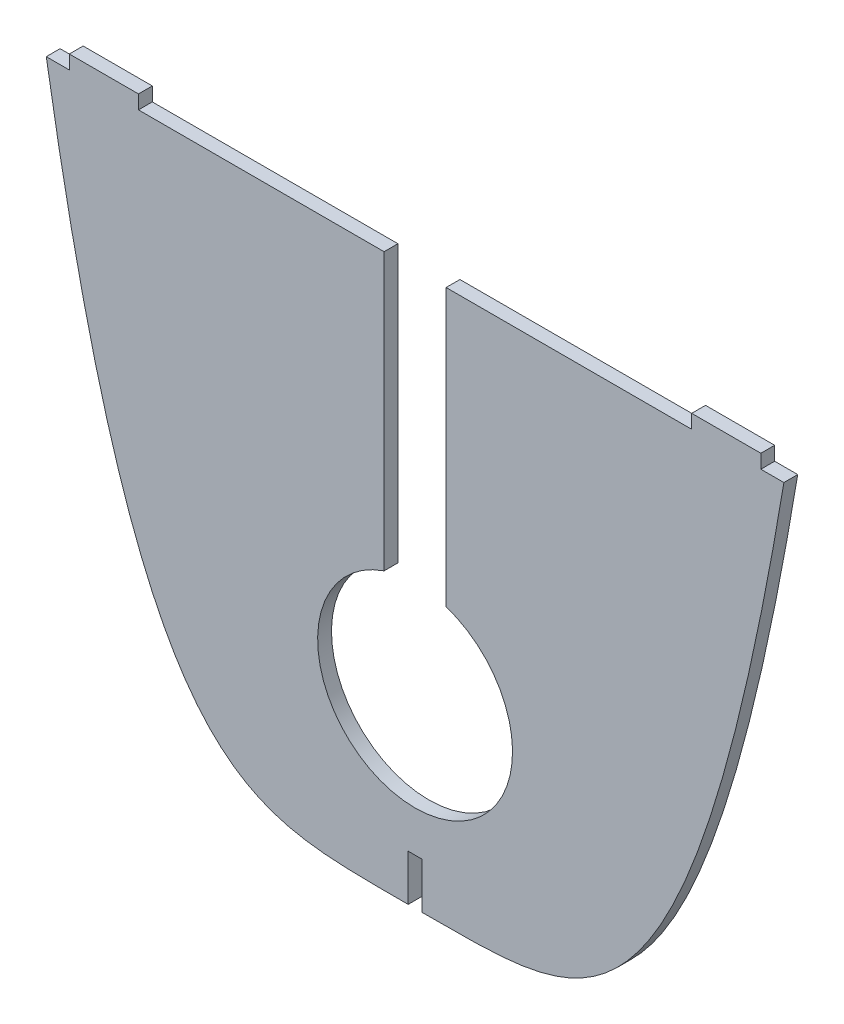
ISO-10303-21;
HEADER;
FILE_DESCRIPTION(('STEP AP214'),'2;1');
FILE_NAME('part.step','',(''),(''),'','','');
FILE_SCHEMA(('AUTOMOTIVE_DESIGN { 1 0 10303 214 1 1 1 1 }'));
ENDSEC;
DATA;
#1=APPLICATION_CONTEXT('core data for automotive mechanical design processes');
#2=APPLICATION_PROTOCOL_DEFINITION('international standard','automotive_design',2000,#1);
#3=PRODUCT_CONTEXT('',#1,'mechanical');
#4=PRODUCT('Part','Part','',(#3));
#5=PRODUCT_RELATED_PRODUCT_CATEGORY('part','',(#4));
#6=PRODUCT_DEFINITION_FORMATION('','',#4);
#7=PRODUCT_DEFINITION_CONTEXT('part definition',#1,'design');
#8=PRODUCT_DEFINITION('design','',#6,#7);
#9=PRODUCT_DEFINITION_SHAPE('','',#8);
#10=(LENGTH_UNIT() NAMED_UNIT(*) SI_UNIT(.MILLI.,.METRE.));
#11=(NAMED_UNIT(*) PLANE_ANGLE_UNIT() SI_UNIT($,.RADIAN.));
#12=(NAMED_UNIT(*) SI_UNIT($,.STERADIAN.) SOLID_ANGLE_UNIT());
#13=UNCERTAINTY_MEASURE_WITH_UNIT(LENGTH_MEASURE(1.E-05),#10,'distance_accuracy_value','');
#14=(GEOMETRIC_REPRESENTATION_CONTEXT(3) GLOBAL_UNCERTAINTY_ASSIGNED_CONTEXT((#13)) GLOBAL_UNIT_ASSIGNED_CONTEXT((#10,
#11,#12)) REPRESENTATION_CONTEXT('',''));
#15=CARTESIAN_POINT('',(0.,0.,0.));
#16=DIRECTION('',(0.,0.,1.));
#17=DIRECTION('',(1.,0.,0.));
#18=AXIS2_PLACEMENT_3D('',#15,#16,#17);
#19=CARTESIAN_POINT('',(-80.0000000053651,119.999999903766,3.));
#20=CARTESIAN_POINT('',(-39.999999975373,-120.000000248008,3.));
#21=CARTESIAN_POINT('',(2.93161022801164E-08,120.000000082844,3.));
#22=CARTESIAN_POINT('',(40.0000000593082,-120.000000418652,3.));
#23=CARTESIAN_POINT('',(80.0000000639973,120.000000261923,3.));
#24=B_SPLINE_CURVE_WITH_KNOTS('',4,(#19,#20,#21,#22,#23),.UNSPECIFIED.,.F.,.F.,(5,5),
(0.0288543219828918,0.971145678360379),.UNSPECIFIED.);
#25=DIRECTION('',(0.,0.,-1.));
#26=VECTOR('',#25,1.);
#27=SURFACE_OF_LINEAR_EXTRUSION('',#24,#26);
#28=CARTESIAN_POINT('',(-80.0000000053651,119.999999903766,0.));
#29=CARTESIAN_POINT('',(-39.999999975373,-120.000000248008,0.));
#30=CARTESIAN_POINT('',(2.93161022801164E-08,120.000000082844,0.));
#31=CARTESIAN_POINT('',(40.0000000593082,-120.000000418652,0.));
#32=CARTESIAN_POINT('',(80.0000000639973,120.000000261923,0.));
#33=B_SPLINE_CURVE_WITH_KNOTS('',4,(#28,#29,#30,#31,#32),.UNSPECIFIED.,.F.,.F.,(5,5),
(0.0288543219828918,0.971145678360379),.UNSPECIFIED.);
#34=CARTESIAN_POINT('',(-80.0000000053651,119.999999903766,0.));
#35=VERTEX_POINT('',#34);
#36=CARTESIAN_POINT('',(-1.49999999999999,1.47062215494968E-05,0.));
#37=VERTEX_POINT('',#36);
#38=EDGE_CURVE('E305',#35,#37,#33,.T.);
#39=ORIENTED_EDGE('',*,*,#38,.T.);
#40=DIRECTION('',(0.,0.,-1.));
#41=VECTOR('',#40,1.);
#42=CARTESIAN_POINT('',(-1.49999999999999,1.47062215494968E-05,3.));
#43=LINE('',#42,#41);
#44=CARTESIAN_POINT('',(-1.5,1.47062215495597E-05,3.));
#45=VERTEX_POINT('',#44);
#46=EDGE_CURVE('E52',#37,#45,#43,.F.);
#47=ORIENTED_EDGE('',*,*,#46,.T.);
#48=CARTESIAN_POINT('',(-80.0000000053651,119.999999903766,3.));
#49=VERTEX_POINT('',#48);
#50=EDGE_CURVE('E256',#49,#45,#24,.T.);
#51=ORIENTED_EDGE('',*,*,#50,.F.);
#52=DIRECTION('',(0.,0.,-1.));
#53=VECTOR('',#52,1.);
#54=CARTESIAN_POINT('',(-80.0000000053651,119.999999903766,3.));
#55=LINE('',#54,#53);
#56=EDGE_CURVE('E307',#49,#35,#55,.T.);
#57=ORIENTED_EDGE('',*,*,#56,.T.);
#58=EDGE_LOOP('',(#39,#47,#51,#57));
#59=FACE_BOUND('',#58,.T.);
#60=ADVANCED_FACE('F43',(#59),#27,.F.);
#61=CARTESIAN_POINT('',(-6.72511862321923,120.000000041199,3.));
#62=DIRECTION('',(1.,0.,0.));
#63=DIRECTION('',(0.,0.,-1.));
#64=AXIS2_PLACEMENT_3D('',#61,#62,#63);
#65=PLANE('',#64);
#66=DIRECTION('',(0.,-1.,0.));
#67=VECTOR('',#66,1.);
#68=CARTESIAN_POINT('',(-6.72511862321923,120.000000041199,3.));
#69=LINE('',#68,#67);
#70=CARTESIAN_POINT('',(-6.72511862321923,120.000000041199,3.));
#71=VERTEX_POINT('',#70);
#72=CARTESIAN_POINT('',(-6.72511862321923,60.037638454475,3.));
#73=VERTEX_POINT('',#72);
#74=EDGE_CURVE('E215',#71,#73,#69,.T.);
#75=ORIENTED_EDGE('',*,*,#74,.T.);
#76=DIRECTION('',(0.,0.,-1.));
#77=VECTOR('',#76,1.);
#78=CARTESIAN_POINT('',(-6.72511862321923,60.037638454475,3.));
#79=LINE('',#78,#77);
#80=CARTESIAN_POINT('',(-6.72511862321923,60.037638454475,0.));
#81=VERTEX_POINT('',#80);
#82=EDGE_CURVE('E204',#73,#81,#79,.T.);
#83=ORIENTED_EDGE('',*,*,#82,.T.);
#84=DIRECTION('',(0.,-1.,0.));
#85=VECTOR('',#84,1.);
#86=CARTESIAN_POINT('',(-6.72511862321923,120.000000041199,0.));
#87=LINE('',#86,#85);
#88=CARTESIAN_POINT('',(-6.72511862321923,120.000000041199,0.));
#89=VERTEX_POINT('',#88);
#90=EDGE_CURVE('E216',#89,#81,#87,.T.);
#91=ORIENTED_EDGE('',*,*,#90,.F.);
#92=DIRECTION('',(0.,0.,-1.));
#93=VECTOR('',#92,1.);
#94=CARTESIAN_POINT('',(-6.72511862321923,120.000000041199,3.));
#95=LINE('',#94,#93);
#96=EDGE_CURVE('E220',#71,#89,#95,.T.);
#97=ORIENTED_EDGE('',*,*,#96,.F.);
#98=EDGE_LOOP('',(#75,#83,#91,#97));
#99=FACE_BOUND('',#98,.T.);
#100=ADVANCED_FACE('F292',(#99),#65,.T.);
#101=CARTESIAN_POINT('',(6.72511862321923,120.000000041199,3.));
#102=DIRECTION('',(-1.,0.,0.));
#103=DIRECTION('',(0.,-1.,0.));
#104=AXIS2_PLACEMENT_3D('',#101,#102,#103);
#105=PLANE('',#104);
#106=DIRECTION('',(0.,1.,0.));
#107=VECTOR('',#106,1.);
#108=CARTESIAN_POINT('',(6.72511862321923,120.000000041199,0.));
#109=LINE('',#108,#107);
#110=CARTESIAN_POINT('',(6.72511862321924,60.0376384544803,0.));
#111=VERTEX_POINT('',#110);
#112=CARTESIAN_POINT('',(6.72511862321923,120.000000041199,0.));
#113=VERTEX_POINT('',#112);
#114=EDGE_CURVE('E211',#111,#113,#109,.T.);
#115=ORIENTED_EDGE('',*,*,#114,.F.);
#116=DIRECTION('',(0.,0.,-1.));
#117=VECTOR('',#116,1.);
#118=CARTESIAN_POINT('',(6.72511862321924,60.0376384544803,3.));
#119=LINE('',#118,#117);
#120=CARTESIAN_POINT('',(6.72511862321923,60.0376384544803,3.));
#121=VERTEX_POINT('',#120);
#122=EDGE_CURVE('E349',#111,#121,#119,.F.);
#123=ORIENTED_EDGE('',*,*,#122,.T.);
#124=DIRECTION('',(0.,1.,0.));
#125=VECTOR('',#124,1.);
#126=CARTESIAN_POINT('',(6.72511862321923,120.000000041199,3.));
#127=LINE('',#126,#125);
#128=CARTESIAN_POINT('',(6.72511862321923,120.000000041199,3.));
#129=VERTEX_POINT('',#128);
#130=EDGE_CURVE('E212',#121,#129,#127,.T.);
#131=ORIENTED_EDGE('',*,*,#130,.T.);
#132=DIRECTION('',(0.,0.,-1.));
#133=VECTOR('',#132,1.);
#134=CARTESIAN_POINT('',(6.72511862321923,120.000000041199,3.));
#135=LINE('',#134,#133);
#136=EDGE_CURVE('E229',#129,#113,#135,.T.);
#137=ORIENTED_EDGE('',*,*,#136,.T.);
#138=EDGE_LOOP('',(#115,#123,#131,#137));
#139=FACE_BOUND('',#138,.T.);
#140=ADVANCED_FACE('F299',(#139),#105,.T.);
#141=CARTESIAN_POINT('',(-55.,120.000000041199,3.));
#142=DIRECTION('',(0.,-1.,0.));
#143=DIRECTION('',(0.,0.,-1.));
#144=AXIS2_PLACEMENT_3D('',#141,#142,#143);
#145=PLANE('',#144);
#146=ORIENTED_EDGE('',*,*,#136,.F.);
#147=DIRECTION('',(1.,0.,0.));
#148=VECTOR('',#147,1.);
#149=CARTESIAN_POINT('',(55.,119.999999994636,3.));
#150=LINE('',#149,#148);
#151=CARTESIAN_POINT('',(60.,119.999999994636,3.));
#152=VERTEX_POINT('',#151);
#153=EDGE_CURVE('E239',#129,#152,#150,.T.);
#154=ORIENTED_EDGE('',*,*,#153,.T.);
#155=DIRECTION('',(0.,0.,-1.));
#156=VECTOR('',#155,1.);
#157=CARTESIAN_POINT('',(60.,119.999999994636,3.));
#158=LINE('',#157,#156);
#159=CARTESIAN_POINT('',(60.,119.999999994636,0.));
#160=VERTEX_POINT('',#159);
#161=EDGE_CURVE('E374',#152,#160,#158,.T.);
#162=ORIENTED_EDGE('',*,*,#161,.T.);
#163=DIRECTION('',(-1.,0.,0.));
#164=VECTOR('',#163,1.);
#165=CARTESIAN_POINT('',(-55.,120.000000041199,0.));
#166=LINE('',#165,#164);
#167=EDGE_CURVE('E341',#160,#113,#166,.T.);
#168=ORIENTED_EDGE('',*,*,#167,.T.);
#169=EDGE_LOOP('',(#146,#154,#162,#168));
#170=FACE_BOUND('',#169,.T.);
#171=ADVANCED_FACE('F419',(#170),#145,.F.);
#172=ORIENTED_EDGE('',*,*,#96,.T.);
#173=CARTESIAN_POINT('',(-60.,120.000000041199,0.));
#174=VERTEX_POINT('',#173);
#175=EDGE_CURVE('E340',#89,#174,#166,.T.);
#176=ORIENTED_EDGE('',*,*,#175,.T.);
#177=DIRECTION('',(0.,0.,-1.));
#178=VECTOR('',#177,1.);
#179=CARTESIAN_POINT('',(-60.,120.000000041199,3.));
#180=LINE('',#179,#178);
#181=CARTESIAN_POINT('',(-60.,120.000000041199,3.));
#182=VERTEX_POINT('',#181);
#183=EDGE_CURVE('E345',#182,#174,#180,.T.);
#184=ORIENTED_EDGE('',*,*,#183,.F.);
#185=EDGE_CURVE('E234',#182,#71,#150,.T.);
#186=ORIENTED_EDGE('',*,*,#185,.T.);
#187=EDGE_LOOP('',(#172,#176,#184,#186));
#188=FACE_BOUND('',#187,.T.);
#189=ADVANCED_FACE('F400',(#188),#145,.F.);
#190=CARTESIAN_POINT('',(-34.8489670671047,78.1029869185064,3.));
#191=DIRECTION('',(0.,0.,-1.));
#192=DIRECTION('',(-1.,0.,0.));
#193=AXIS2_PLACEMENT_3D('',#190,#191,#192);
#194=PLANE('',#193);
#195=ORIENTED_EDGE('',*,*,#50,.T.);
#196=DIRECTION('',(0.,-1.,0.));
#197=VECTOR('',#196,1.);
#198=CARTESIAN_POINT('',(-1.5,10.,3.));
#199=LINE('',#198,#197);
#200=CARTESIAN_POINT('',(-1.5,10.,3.));
#201=VERTEX_POINT('',#200);
#202=EDGE_CURVE('E186',#201,#45,#199,.T.);
#203=ORIENTED_EDGE('',*,*,#202,.F.);
#204=DIRECTION('',(-1.,0.,0.));
#205=VECTOR('',#204,1.);
#206=CARTESIAN_POINT('',(-1.5,10.,3.));
#207=LINE('',#206,#205);
#208=CARTESIAN_POINT('',(1.5,10.,3.));
#209=VERTEX_POINT('',#208);
#210=EDGE_CURVE('E173',#209,#201,#207,.T.);
#211=ORIENTED_EDGE('',*,*,#210,.F.);
#212=DIRECTION('',(0.,1.,0.));
#213=VECTOR('',#212,1.);
#214=CARTESIAN_POINT('',(1.5,10.,3.));
#215=LINE('',#214,#213);
#216=CARTESIAN_POINT('',(1.5,1.47063791804125E-05,3.));
#217=VERTEX_POINT('',#216);
#218=EDGE_CURVE('E180',#217,#209,#215,.T.);
#219=ORIENTED_EDGE('',*,*,#218,.F.);
#220=CARTESIAN_POINT('',(80.0000000639993,120.000000261935,3.));
#221=VERTEX_POINT('',#220);
#222=EDGE_CURVE('E255',#217,#221,#24,.T.);
#223=ORIENTED_EDGE('',*,*,#222,.T.);
#224=DIRECTION('',(1.,0.,0.));
#225=VECTOR('',#224,1.);
#226=CARTESIAN_POINT('',(75.0000000598274,120.000000261935,3.));
#227=LINE('',#226,#225);
#228=CARTESIAN_POINT('',(75.0000000598274,120.000000261935,3.));
#229=VERTEX_POINT('',#228);
#230=EDGE_CURVE('E251',#229,#221,#227,.T.);
#231=ORIENTED_EDGE('',*,*,#230,.F.);
#232=DIRECTION('',(0.,-1.,0.));
#233=VECTOR('',#232,1.);
#234=CARTESIAN_POINT('',(75.0000000598274,123.000000212502,3.));
#235=LINE('',#234,#233);
#236=CARTESIAN_POINT('',(75.0000000598274,123.000000212502,3.));
#237=VERTEX_POINT('',#236);
#238=EDGE_CURVE('E247',#237,#229,#235,.T.);
#239=ORIENTED_EDGE('',*,*,#238,.F.);
#240=DIRECTION('',(1.,0.,0.));
#241=VECTOR('',#240,1.);
#242=CARTESIAN_POINT('',(60.,123.000000212502,3.));
#243=LINE('',#242,#241);
#244=CARTESIAN_POINT('',(60.,123.000000212502,3.));
#245=VERTEX_POINT('',#244);
#246=EDGE_CURVE('E243',#245,#237,#243,.T.);
#247=ORIENTED_EDGE('',*,*,#246,.F.);
#248=DIRECTION('',(0.,1.,0.));
#249=VECTOR('',#248,1.);
#250=CARTESIAN_POINT('',(60.,119.999999994636,3.));
#251=LINE('',#250,#249);
#252=EDGE_CURVE('E238',#152,#245,#251,.T.);
#253=ORIENTED_EDGE('',*,*,#252,.F.);
#254=ORIENTED_EDGE('',*,*,#153,.F.);
#255=ORIENTED_EDGE('',*,*,#130,.F.);
#256=CARTESIAN_POINT('',(7.88091943961699E-12,40.0000000000077,3.));
#257=DIRECTION('',(0.,0.,1.));
#258=DIRECTION('',(1.,0.,0.));
#259=AXIS2_PLACEMENT_3D('',#256,#257,#258);
#260=CIRCLE('',#259,21.1360870391949);
#261=EDGE_CURVE('E67',#73,#121,#260,.T.);
#262=ORIENTED_EDGE('',*,*,#261,.F.);
#263=ORIENTED_EDGE('',*,*,#74,.F.);
#264=ORIENTED_EDGE('',*,*,#185,.F.);
#265=DIRECTION('',(0.,-1.,0.));
#266=VECTOR('',#265,1.);
#267=CARTESIAN_POINT('',(-60.,123.000000023822,3.));
#268=LINE('',#267,#266);
#269=CARTESIAN_POINT('',(-60.,123.000000023822,3.));
#270=VERTEX_POINT('',#269);
#271=EDGE_CURVE('E378',#270,#182,#268,.T.);
#272=ORIENTED_EDGE('',*,*,#271,.F.);
#273=DIRECTION('',(1.,0.,0.));
#274=VECTOR('',#273,1.);
#275=CARTESIAN_POINT('',(-75.0000000011823,123.000000023822,3.));
#276=LINE('',#275,#274);
#277=CARTESIAN_POINT('',(-75.0000000011823,123.000000023822,3.));
#278=VERTEX_POINT('',#277);
#279=EDGE_CURVE('E386',#278,#270,#276,.T.);
#280=ORIENTED_EDGE('',*,*,#279,.F.);
#281=DIRECTION('',(0.,-1.,0.));
#282=VECTOR('',#281,1.);
#283=CARTESIAN_POINT('',(-75.0000000011823,123.000000023822,3.));
#284=LINE('',#283,#282);
#285=CARTESIAN_POINT('',(-75.0000000011823,119.999999901191,3.));
#286=VERTEX_POINT('',#285);
#287=EDGE_CURVE('E390',#278,#286,#284,.T.);
#288=ORIENTED_EDGE('',*,*,#287,.T.);
#289=DIRECTION('',(1.,0.,0.));
#290=VECTOR('',#289,1.);
#291=CARTESIAN_POINT('',(-80.0000000049359,119.999999901191,3.));
#292=LINE('',#291,#290);
#293=EDGE_CURVE('E262',#49,#286,#292,.T.);
#294=ORIENTED_EDGE('',*,*,#293,.F.);
#295=EDGE_LOOP('',(#195,#203,#211,#219,#223,#231,#239,#247,#253,#254,#255,#262,#263,#264,#272,
#280,#288,#294));
#296=FACE_BOUND('',#295,.T.);
#297=ADVANCED_FACE('F189',(#296),#194,.F.);
#298=CARTESIAN_POINT('',(-34.8489670671047,78.1029869185064,0.));
#299=DIRECTION('',(0.,0.,-1.));
#300=DIRECTION('',(-1.,0.,0.));
#301=AXIS2_PLACEMENT_3D('',#298,#299,#300);
#302=PLANE('',#301);
#303=DIRECTION('',(0.,1.,0.));
#304=VECTOR('',#303,1.);
#305=CARTESIAN_POINT('',(-1.50000000000001,78.1029869185064,0.));
#306=LINE('',#305,#304);
#307=CARTESIAN_POINT('',(-1.5,10.,0.));
#308=VERTEX_POINT('',#307);
#309=EDGE_CURVE('E198',#37,#308,#306,.T.);
#310=ORIENTED_EDGE('',*,*,#309,.F.);
#311=ORIENTED_EDGE('',*,*,#38,.F.);
#312=DIRECTION('',(1.,0.,0.));
#313=VECTOR('',#312,1.);
#314=CARTESIAN_POINT('',(-80.0000000049359,119.999999901191,0.));
#315=LINE('',#314,#313);
#316=CARTESIAN_POINT('',(-75.0000000011823,119.999999901191,0.));
#317=VERTEX_POINT('',#316);
#318=EDGE_CURVE('E313',#35,#317,#315,.T.);
#319=ORIENTED_EDGE('',*,*,#318,.T.);
#320=DIRECTION('',(0.,-1.,0.));
#321=VECTOR('',#320,1.);
#322=CARTESIAN_POINT('',(-75.0000000011823,123.000000023822,0.));
#323=LINE('',#322,#321);
#324=CARTESIAN_POINT('',(-75.0000000011823,123.000000023822,0.));
#325=VERTEX_POINT('',#324);
#326=EDGE_CURVE('E318',#325,#317,#323,.T.);
#327=ORIENTED_EDGE('',*,*,#326,.F.);
#328=DIRECTION('',(1.,0.,0.));
#329=VECTOR('',#328,1.);
#330=CARTESIAN_POINT('',(-75.0000000011823,123.000000023822,0.));
#331=LINE('',#330,#329);
#332=CARTESIAN_POINT('',(-60.,123.000000023822,0.));
#333=VERTEX_POINT('',#332);
#334=EDGE_CURVE('E332',#325,#333,#331,.T.);
#335=ORIENTED_EDGE('',*,*,#334,.T.);
#336=DIRECTION('',(0.,-1.,0.));
#337=VECTOR('',#336,1.);
#338=CARTESIAN_POINT('',(-60.,123.000000023822,0.));
#339=LINE('',#338,#337);
#340=EDGE_CURVE('E336',#333,#174,#339,.T.);
#341=ORIENTED_EDGE('',*,*,#340,.T.);
#342=ORIENTED_EDGE('',*,*,#175,.F.);
#343=ORIENTED_EDGE('',*,*,#90,.T.);
#344=CARTESIAN_POINT('',(7.88091943961699E-12,40.0000000000077,0.));
#345=DIRECTION('',(0.,0.,1.));
#346=DIRECTION('',(1.,0.,0.));
#347=AXIS2_PLACEMENT_3D('',#344,#345,#346);
#348=CIRCLE('',#347,21.1360870391949);
#349=EDGE_CURVE('E201',#81,#111,#348,.T.);
#350=ORIENTED_EDGE('',*,*,#349,.T.);
#351=ORIENTED_EDGE('',*,*,#114,.T.);
#352=ORIENTED_EDGE('',*,*,#167,.F.);
#353=DIRECTION('',(0.,1.,0.));
#354=VECTOR('',#353,1.);
#355=CARTESIAN_POINT('',(60.,119.999999994636,0.));
#356=LINE('',#355,#354);
#357=CARTESIAN_POINT('',(60.,123.000000212502,0.));
#358=VERTEX_POINT('',#357);
#359=EDGE_CURVE('E233',#160,#358,#356,.T.);
#360=ORIENTED_EDGE('',*,*,#359,.T.);
#361=DIRECTION('',(1.,0.,0.));
#362=VECTOR('',#361,1.);
#363=CARTESIAN_POINT('',(60.,123.000000212502,0.));
#364=LINE('',#363,#362);
#365=CARTESIAN_POINT('',(75.0000000598274,123.000000212502,0.));
#366=VERTEX_POINT('',#365);
#367=EDGE_CURVE('E425',#358,#366,#364,.T.);
#368=ORIENTED_EDGE('',*,*,#367,.T.);
#369=DIRECTION('',(0.,-1.,0.));
#370=VECTOR('',#369,1.);
#371=CARTESIAN_POINT('',(75.0000000598274,123.000000212502,0.));
#372=LINE('',#371,#370);
#373=CARTESIAN_POINT('',(75.0000000598274,120.000000261935,0.));
#374=VERTEX_POINT('',#373);
#375=EDGE_CURVE('E429',#366,#374,#372,.T.);
#376=ORIENTED_EDGE('',*,*,#375,.T.);
#377=DIRECTION('',(1.,0.,0.));
#378=VECTOR('',#377,1.);
#379=CARTESIAN_POINT('',(75.0000000598274,120.000000261935,0.));
#380=LINE('',#379,#378);
#381=CARTESIAN_POINT('',(80.0000000639993,120.000000261935,0.));
#382=VERTEX_POINT('',#381);
#383=EDGE_CURVE('E320',#374,#382,#380,.T.);
#384=ORIENTED_EDGE('',*,*,#383,.T.);
#385=CARTESIAN_POINT('',(1.50000000000175,1.47063791816823E-05,0.));
#386=VERTEX_POINT('',#385);
#387=EDGE_CURVE('E314',#386,#382,#33,.T.);
#388=ORIENTED_EDGE('',*,*,#387,.F.);
#389=DIRECTION('',(0.,-1.,0.));
#390=VECTOR('',#389,1.);
#391=CARTESIAN_POINT('',(1.49999999999999,78.1029869185064,0.));
#392=LINE('',#391,#390);
#393=CARTESIAN_POINT('',(1.5,10.,0.));
#394=VERTEX_POINT('',#393);
#395=EDGE_CURVE('E59',#394,#386,#392,.T.);
#396=ORIENTED_EDGE('',*,*,#395,.F.);
#397=DIRECTION('',(1.,0.,0.));
#398=VECTOR('',#397,1.);
#399=CARTESIAN_POINT('',(-34.8489670671047,9.99999999999999,0.));
#400=LINE('',#399,#398);
#401=EDGE_CURVE('E11',#308,#394,#400,.T.);
#402=ORIENTED_EDGE('',*,*,#401,.F.);
#403=EDGE_LOOP('',(#310,#311,#319,#327,#335,#341,#342,#343,#350,#351,#352,#360,#368,#376,#384,
#388,#396,#402));
#404=FACE_BOUND('',#403,.T.);
#405=ADVANCED_FACE('F405',(#404),#302,.T.);
#406=CARTESIAN_POINT('',(-60.,123.000000023822,3.));
#407=DIRECTION('',(1.,0.,0.));
#408=DIRECTION('',(0.,0.,-1.));
#409=AXIS2_PLACEMENT_3D('',#406,#407,#408);
#410=PLANE('',#409);
#411=ORIENTED_EDGE('',*,*,#340,.F.);
#412=DIRECTION('',(0.,0.,-1.));
#413=VECTOR('',#412,1.);
#414=CARTESIAN_POINT('',(-60.,123.000000023822,3.));
#415=LINE('',#414,#413);
#416=EDGE_CURVE('E350',#270,#333,#415,.T.);
#417=ORIENTED_EDGE('',*,*,#416,.F.);
#418=ORIENTED_EDGE('',*,*,#271,.T.);
#419=ORIENTED_EDGE('',*,*,#183,.T.);
#420=EDGE_LOOP('',(#411,#417,#418,#419));
#421=FACE_BOUND('',#420,.T.);
#422=ADVANCED_FACE('F403',(#421),#410,.T.);
#423=CARTESIAN_POINT('',(-75.0000000011823,123.000000023822,3.));
#424=DIRECTION('',(0.,1.,0.));
#425=DIRECTION('',(0.,0.,1.));
#426=AXIS2_PLACEMENT_3D('',#423,#424,#425);
#427=PLANE('',#426);
#428=ORIENTED_EDGE('',*,*,#334,.F.);
#429=DIRECTION('',(0.,0.,-1.));
#430=VECTOR('',#429,1.);
#431=CARTESIAN_POINT('',(-75.0000000011823,123.000000023822,3.));
#432=LINE('',#431,#430);
#433=EDGE_CURVE('E353',#278,#325,#432,.T.);
#434=ORIENTED_EDGE('',*,*,#433,.F.);
#435=ORIENTED_EDGE('',*,*,#279,.T.);
#436=ORIENTED_EDGE('',*,*,#416,.T.);
#437=EDGE_LOOP('',(#428,#434,#435,#436));
#438=FACE_BOUND('',#437,.T.);
#439=ADVANCED_FACE('F409',(#438),#427,.T.);
#440=CARTESIAN_POINT('',(-75.0000000011823,123.000000023822,3.));
#441=DIRECTION('',(1.,0.,0.));
#442=DIRECTION('',(0.,0.,-1.));
#443=AXIS2_PLACEMENT_3D('',#440,#441,#442);
#444=PLANE('',#443);
#445=ORIENTED_EDGE('',*,*,#326,.T.);
#446=DIRECTION('',(0.,0.,-1.));
#447=VECTOR('',#446,1.);
#448=CARTESIAN_POINT('',(-75.0000000011823,119.999999901191,3.));
#449=LINE('',#448,#447);
#450=EDGE_CURVE('E356',#286,#317,#449,.T.);
#451=ORIENTED_EDGE('',*,*,#450,.F.);
#452=ORIENTED_EDGE('',*,*,#287,.F.);
#453=ORIENTED_EDGE('',*,*,#433,.T.);
#454=EDGE_LOOP('',(#445,#451,#452,#453));
#455=FACE_BOUND('',#454,.T.);
#456=ADVANCED_FACE('F466',(#455),#444,.F.);
#457=CARTESIAN_POINT('',(-80.0000000049359,119.999999901191,3.));
#458=DIRECTION('',(0.,1.,0.));
#459=DIRECTION('',(0.,0.,1.));
#460=AXIS2_PLACEMENT_3D('',#457,#458,#459);
#461=PLANE('',#460);
#462=ORIENTED_EDGE('',*,*,#318,.F.);
#463=ORIENTED_EDGE('',*,*,#56,.F.);
#464=ORIENTED_EDGE('',*,*,#293,.T.);
#465=ORIENTED_EDGE('',*,*,#450,.T.);
#466=EDGE_LOOP('',(#462,#463,#464,#465));
#467=FACE_BOUND('',#466,.T.);
#468=ADVANCED_FACE('F273',(#467),#461,.T.);
#469=ORIENTED_EDGE('',*,*,#222,.F.);
#470=DIRECTION('',(0.,0.,-1.));
#471=VECTOR('',#470,1.);
#472=CARTESIAN_POINT('',(1.50000000000175,1.47063791816823E-05,3.));
#473=LINE('',#472,#471);
#474=EDGE_CURVE('E182',#217,#386,#473,.T.);
#475=ORIENTED_EDGE('',*,*,#474,.T.);
#476=ORIENTED_EDGE('',*,*,#387,.T.);
#477=DIRECTION('',(0.,0.,-1.));
#478=VECTOR('',#477,1.);
#479=CARTESIAN_POINT('',(80.0000000639993,120.000000261935,3.));
#480=LINE('',#479,#478);
#481=EDGE_CURVE('E361',#221,#382,#480,.T.);
#482=ORIENTED_EDGE('',*,*,#481,.F.);
#483=EDGE_LOOP('',(#469,#475,#476,#482));
#484=FACE_BOUND('',#483,.T.);
#485=ADVANCED_FACE('F268',(#484),#27,.F.);
#486=CARTESIAN_POINT('',(75.0000000598274,120.000000261935,3.));
#487=DIRECTION('',(0.,1.,0.));
#488=DIRECTION('',(0.,0.,1.));
#489=AXIS2_PLACEMENT_3D('',#486,#487,#488);
#490=PLANE('',#489);
#491=ORIENTED_EDGE('',*,*,#383,.F.);
#492=DIRECTION('',(0.,0.,-1.));
#493=VECTOR('',#492,1.);
#494=CARTESIAN_POINT('',(75.0000000598274,120.000000261935,3.));
#495=LINE('',#494,#493);
#496=EDGE_CURVE('E365',#229,#374,#495,.T.);
#497=ORIENTED_EDGE('',*,*,#496,.F.);
#498=ORIENTED_EDGE('',*,*,#230,.T.);
#499=ORIENTED_EDGE('',*,*,#481,.T.);
#500=EDGE_LOOP('',(#491,#497,#498,#499));
#501=FACE_BOUND('',#500,.T.);
#502=ADVANCED_FACE('F272',(#501),#490,.T.);
#503=CARTESIAN_POINT('',(75.0000000598274,123.000000212502,3.));
#504=DIRECTION('',(1.,0.,0.));
#505=DIRECTION('',(0.,0.,-1.));
#506=AXIS2_PLACEMENT_3D('',#503,#504,#505);
#507=PLANE('',#506);
#508=ORIENTED_EDGE('',*,*,#375,.F.);
#509=DIRECTION('',(0.,0.,-1.));
#510=VECTOR('',#509,1.);
#511=CARTESIAN_POINT('',(75.0000000598274,123.000000212502,3.));
#512=LINE('',#511,#510);
#513=EDGE_CURVE('E368',#237,#366,#512,.T.);
#514=ORIENTED_EDGE('',*,*,#513,.F.);
#515=ORIENTED_EDGE('',*,*,#238,.T.);
#516=ORIENTED_EDGE('',*,*,#496,.T.);
#517=EDGE_LOOP('',(#508,#514,#515,#516));
#518=FACE_BOUND('',#517,.T.);
#519=ADVANCED_FACE('F278',(#518),#507,.T.);
#520=CARTESIAN_POINT('',(60.,123.000000212502,3.));
#521=DIRECTION('',(0.,1.,0.));
#522=DIRECTION('',(0.,0.,1.));
#523=AXIS2_PLACEMENT_3D('',#520,#521,#522);
#524=PLANE('',#523);
#525=ORIENTED_EDGE('',*,*,#367,.F.);
#526=DIRECTION('',(0.,0.,-1.));
#527=VECTOR('',#526,1.);
#528=CARTESIAN_POINT('',(60.,123.000000212502,3.));
#529=LINE('',#528,#527);
#530=EDGE_CURVE('E371',#245,#358,#529,.T.);
#531=ORIENTED_EDGE('',*,*,#530,.F.);
#532=ORIENTED_EDGE('',*,*,#246,.T.);
#533=ORIENTED_EDGE('',*,*,#513,.T.);
#534=EDGE_LOOP('',(#525,#531,#532,#533));
#535=FACE_BOUND('',#534,.T.);
#536=ADVANCED_FACE('F281',(#535),#524,.T.);
#537=CARTESIAN_POINT('',(60.,119.999999994636,3.));
#538=DIRECTION('',(-1.,0.,0.));
#539=DIRECTION('',(0.,0.,1.));
#540=AXIS2_PLACEMENT_3D('',#537,#538,#539);
#541=PLANE('',#540);
#542=ORIENTED_EDGE('',*,*,#359,.F.);
#543=ORIENTED_EDGE('',*,*,#161,.F.);
#544=ORIENTED_EDGE('',*,*,#252,.T.);
#545=ORIENTED_EDGE('',*,*,#530,.T.);
#546=EDGE_LOOP('',(#542,#543,#544,#545));
#547=FACE_BOUND('',#546,.T.);
#548=ADVANCED_FACE('F45',(#547),#541,.T.);
#549=CARTESIAN_POINT('',(7.88091943961699E-12,40.0000000000077,3.));
#550=DIRECTION('',(0.,0.,-1.));
#551=DIRECTION('',(-1.,0.,0.));
#552=AXIS2_PLACEMENT_3D('',#549,#550,#551);
#553=CYLINDRICAL_SURFACE('',#552,21.1360870391949);
#554=ORIENTED_EDGE('',*,*,#261,.T.);
#555=ORIENTED_EDGE('',*,*,#122,.F.);
#556=ORIENTED_EDGE('',*,*,#349,.F.);
#557=ORIENTED_EDGE('',*,*,#82,.F.);
#558=EDGE_LOOP('',(#554,#555,#556,#557));
#559=FACE_BOUND('',#558,.T.);
#560=ADVANCED_FACE('F288',(#559),#553,.F.);
#561=CARTESIAN_POINT('',(-1.5,10.,-7.));
#562=DIRECTION('',(-1.,0.,0.));
#563=DIRECTION('',(0.,-1.,0.));
#564=AXIS2_PLACEMENT_3D('',#561,#562,#563);
#565=PLANE('',#564);
#566=ORIENTED_EDGE('',*,*,#309,.T.);
#567=DIRECTION('',(0.,0.,1.));
#568=VECTOR('',#567,1.);
#569=CARTESIAN_POINT('',(-1.5,10.,-7.));
#570=LINE('',#569,#568);
#571=EDGE_CURVE('E177',#308,#201,#570,.T.);
#572=ORIENTED_EDGE('',*,*,#571,.T.);
#573=ORIENTED_EDGE('',*,*,#202,.T.);
#574=ORIENTED_EDGE('',*,*,#46,.F.);
#575=EDGE_LOOP('',(#566,#572,#573,#574));
#576=FACE_BOUND('',#575,.T.);
#577=ADVANCED_FACE('F443',(#576),#565,.F.);
#578=CARTESIAN_POINT('',(-1.5,10.,-7.));
#579=DIRECTION('',(0.,1.,0.));
#580=DIRECTION('',(0.,0.,1.));
#581=AXIS2_PLACEMENT_3D('',#578,#579,#580);
#582=PLANE('',#581);
#583=ORIENTED_EDGE('',*,*,#401,.T.);
#584=DIRECTION('',(0.,0.,1.));
#585=VECTOR('',#584,1.);
#586=CARTESIAN_POINT('',(1.5,10.,-7.));
#587=LINE('',#586,#585);
#588=EDGE_CURVE('E168',#394,#209,#587,.T.);
#589=ORIENTED_EDGE('',*,*,#588,.T.);
#590=ORIENTED_EDGE('',*,*,#210,.T.);
#591=ORIENTED_EDGE('',*,*,#571,.F.);
#592=EDGE_LOOP('',(#583,#589,#590,#591));
#593=FACE_BOUND('',#592,.T.);
#594=ADVANCED_FACE('F170',(#593),#582,.F.);
#595=CARTESIAN_POINT('',(1.5,10.,-7.));
#596=DIRECTION('',(1.,0.,0.));
#597=DIRECTION('',(0.,1.,0.));
#598=AXIS2_PLACEMENT_3D('',#595,#596,#597);
#599=PLANE('',#598);
#600=ORIENTED_EDGE('',*,*,#395,.T.);
#601=ORIENTED_EDGE('',*,*,#474,.F.);
#602=ORIENTED_EDGE('',*,*,#218,.T.);
#603=ORIENTED_EDGE('',*,*,#588,.F.);
#604=EDGE_LOOP('',(#600,#601,#602,#603));
#605=FACE_BOUND('',#604,.T.);
#606=ADVANCED_FACE('F181',(#605),#599,.F.);
#607=CLOSED_SHELL('',(#60,#100,#140,#171,#189,#297,#405,#422,#439,#456,#468,#485,#502,#519,#536,
#548,#560,#577,#594,#606));
#608=MANIFOLD_SOLID_BREP('B2',#607);
#609=ADVANCED_BREP_SHAPE_REPRESENTATION('',(#18,#608),#14);
#610=SHAPE_DEFINITION_REPRESENTATION(#9,#609);
ENDSEC;
END-ISO-10303-21;
